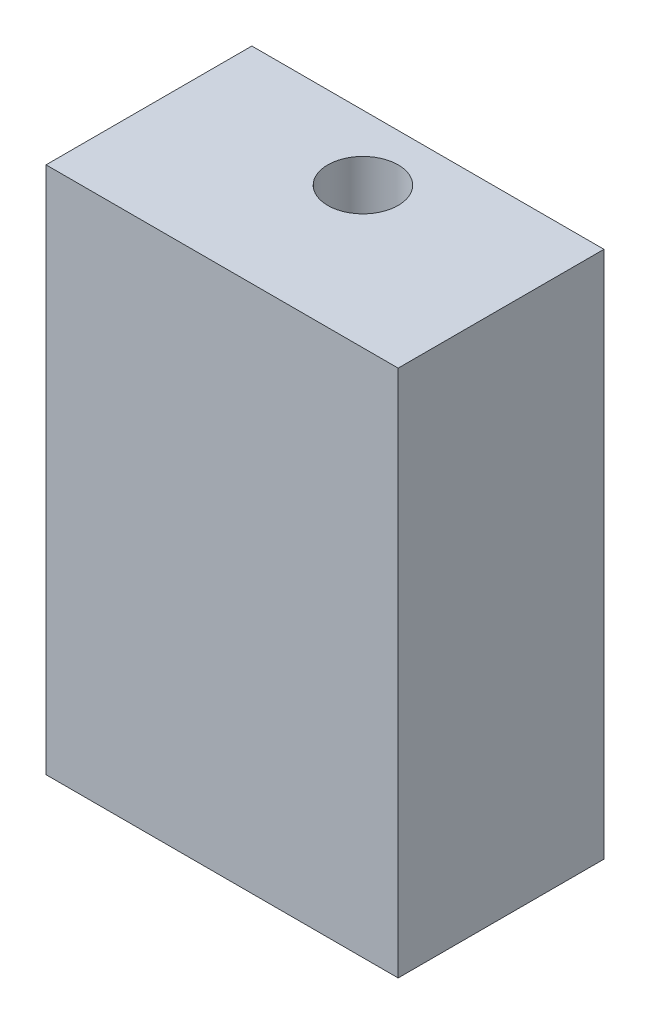
ISO-10303-21;
HEADER;
FILE_DESCRIPTION(('STEP AP214'),'2;1');
FILE_NAME('part.step','',(''),(''),'','','');
FILE_SCHEMA(('AUTOMOTIVE_DESIGN { 1 0 10303 214 1 1 1 1 }'));
ENDSEC;
DATA;
#1=APPLICATION_CONTEXT('core data for automotive mechanical design processes');
#2=APPLICATION_PROTOCOL_DEFINITION('international standard','automotive_design',2000,#1);
#3=PRODUCT_CONTEXT('',#1,'mechanical');
#4=PRODUCT('Part','Part','',(#3));
#5=PRODUCT_RELATED_PRODUCT_CATEGORY('part','',(#4));
#6=PRODUCT_DEFINITION_FORMATION('','',#4);
#7=PRODUCT_DEFINITION_CONTEXT('part definition',#1,'design');
#8=PRODUCT_DEFINITION('design','',#6,#7);
#9=PRODUCT_DEFINITION_SHAPE('','',#8);
#10=(LENGTH_UNIT() NAMED_UNIT(*) SI_UNIT(.MILLI.,.METRE.));
#11=(NAMED_UNIT(*) PLANE_ANGLE_UNIT() SI_UNIT($,.RADIAN.));
#12=(NAMED_UNIT(*) SI_UNIT($,.STERADIAN.) SOLID_ANGLE_UNIT());
#13=UNCERTAINTY_MEASURE_WITH_UNIT(LENGTH_MEASURE(1.E-05),#10,'distance_accuracy_value','');
#14=(GEOMETRIC_REPRESENTATION_CONTEXT(3) GLOBAL_UNCERTAINTY_ASSIGNED_CONTEXT((#13)) GLOBAL_UNIT_ASSIGNED_CONTEXT((#10,
#11,#12)) REPRESENTATION_CONTEXT('',''));
#15=CARTESIAN_POINT('',(0.,0.,0.));
#16=DIRECTION('',(0.,0.,1.));
#17=DIRECTION('',(1.,0.,0.));
#18=AXIS2_PLACEMENT_3D('',#15,#16,#17);
#19=CARTESIAN_POINT('',(0.,30.,0.));
#20=DIRECTION('',(0.,1.,0.));
#21=DIRECTION('',(0.,0.,1.));
#22=AXIS2_PLACEMENT_3D('',#19,#20,#21);
#23=PLANE('',#22);
#24=DIRECTION('',(0.,0.,1.));
#25=VECTOR('',#24,1.);
#26=CARTESIAN_POINT('',(-10.,30.,-3.69));
#27=LINE('',#26,#25);
#28=CARTESIAN_POINT('',(-10.,30.,-3.69));
#29=VERTEX_POINT('',#28);
#30=CARTESIAN_POINT('',(-10.,30.,8.));
#31=VERTEX_POINT('',#30);
#32=EDGE_CURVE('E87',#29,#31,#27,.T.);
#33=ORIENTED_EDGE('',*,*,#32,.T.);
#34=DIRECTION('',(1.,0.,0.));
#35=VECTOR('',#34,1.);
#36=CARTESIAN_POINT('',(-10.,30.,8.));
#37=LINE('',#36,#35);
#38=CARTESIAN_POINT('',(10.,30.,8.));
#39=VERTEX_POINT('',#38);
#40=EDGE_CURVE('E82',#31,#39,#37,.T.);
#41=ORIENTED_EDGE('',*,*,#40,.T.);
#42=DIRECTION('',(0.,0.,-1.));
#43=VECTOR('',#42,1.);
#44=CARTESIAN_POINT('',(10.,30.,-3.69));
#45=LINE('',#44,#43);
#46=CARTESIAN_POINT('',(10.,30.,-3.69));
#47=VERTEX_POINT('',#46);
#48=EDGE_CURVE('E85',#39,#47,#45,.T.);
#49=ORIENTED_EDGE('',*,*,#48,.T.);
#50=DIRECTION('',(-1.,0.,0.));
#51=VECTOR('',#50,1.);
#52=CARTESIAN_POINT('',(-10.,30.,-3.69));
#53=LINE('',#52,#51);
#54=EDGE_CURVE('E52',#47,#29,#53,.T.);
#55=ORIENTED_EDGE('',*,*,#54,.T.);
#56=EDGE_LOOP('',(#33,#41,#49,#55));
#57=FACE_BOUND('',#56,.T.);
#58=CARTESIAN_POINT('',(0.,30.,0.));
#59=DIRECTION('',(0.,1.,0.));
#60=DIRECTION('',(0.,0.,1.));
#61=AXIS2_PLACEMENT_3D('',#58,#59,#60);
#62=CIRCLE('',#61,2.);
#63=CARTESIAN_POINT('',(0.,30.,2.));
#64=VERTEX_POINT('',#63);
#65=EDGE_CURVE('E102',#64,#64,#62,.T.);
#66=ORIENTED_EDGE('',*,*,#65,.F.);
#67=EDGE_LOOP('',(#66));
#68=FACE_BOUND('',#67,.T.);
#69=ADVANCED_FACE('F35',(#57,#68),#23,.T.);
#70=CARTESIAN_POINT('',(0.,0.,0.));
#71=DIRECTION('',(0.,1.,0.));
#72=DIRECTION('',(0.,0.,1.));
#73=AXIS2_PLACEMENT_3D('',#70,#71,#72);
#74=PLANE('',#73);
#75=DIRECTION('',(0.,0.,1.));
#76=VECTOR('',#75,1.);
#77=CARTESIAN_POINT('',(-10.,0.,-3.69));
#78=LINE('',#77,#76);
#79=CARTESIAN_POINT('',(-10.,0.,-3.69));
#80=VERTEX_POINT('',#79);
#81=CARTESIAN_POINT('',(-10.,0.,8.));
#82=VERTEX_POINT('',#81);
#83=EDGE_CURVE('E99',#80,#82,#78,.T.);
#84=ORIENTED_EDGE('',*,*,#83,.F.);
#85=DIRECTION('',(-1.,0.,0.));
#86=VECTOR('',#85,1.);
#87=CARTESIAN_POINT('',(-10.,0.,-3.69));
#88=LINE('',#87,#86);
#89=CARTESIAN_POINT('',(10.,0.,-3.69));
#90=VERTEX_POINT('',#89);
#91=EDGE_CURVE('E75',#90,#80,#88,.T.);
#92=ORIENTED_EDGE('',*,*,#91,.F.);
#93=DIRECTION('',(0.,0.,-1.));
#94=VECTOR('',#93,1.);
#95=CARTESIAN_POINT('',(10.,0.,-3.69));
#96=LINE('',#95,#94);
#97=CARTESIAN_POINT('',(10.,0.,8.));
#98=VERTEX_POINT('',#97);
#99=EDGE_CURVE('E69',#98,#90,#96,.T.);
#100=ORIENTED_EDGE('',*,*,#99,.F.);
#101=DIRECTION('',(1.,0.,0.));
#102=VECTOR('',#101,1.);
#103=CARTESIAN_POINT('',(-10.,0.,8.));
#104=LINE('',#103,#102);
#105=EDGE_CURVE('E91',#82,#98,#104,.T.);
#106=ORIENTED_EDGE('',*,*,#105,.F.);
#107=EDGE_LOOP('',(#84,#92,#100,#106));
#108=FACE_BOUND('',#107,.T.);
#109=CARTESIAN_POINT('',(0.,0.,0.));
#110=DIRECTION('',(0.,1.,0.));
#111=DIRECTION('',(0.,0.,1.));
#112=AXIS2_PLACEMENT_3D('',#109,#110,#111);
#113=CIRCLE('',#112,2.);
#114=CARTESIAN_POINT('',(0.,0.,2.));
#115=VERTEX_POINT('',#114);
#116=EDGE_CURVE('E114',#115,#115,#113,.T.);
#117=ORIENTED_EDGE('',*,*,#116,.T.);
#118=EDGE_LOOP('',(#117));
#119=FACE_BOUND('',#118,.T.);
#120=ADVANCED_FACE('F110',(#108,#119),#74,.F.);
#121=CARTESIAN_POINT('',(-10.,30.,-3.69));
#122=DIRECTION('',(1.,0.,0.));
#123=DIRECTION('',(0.,0.,-1.));
#124=AXIS2_PLACEMENT_3D('',#121,#122,#123);
#125=PLANE('',#124);
#126=ORIENTED_EDGE('',*,*,#83,.T.);
#127=DIRECTION('',(0.,-1.,0.));
#128=VECTOR('',#127,1.);
#129=CARTESIAN_POINT('',(-10.,30.,8.));
#130=LINE('',#129,#128);
#131=EDGE_CURVE('E11',#31,#82,#130,.T.);
#132=ORIENTED_EDGE('',*,*,#131,.F.);
#133=ORIENTED_EDGE('',*,*,#32,.F.);
#134=DIRECTION('',(0.,-1.,0.));
#135=VECTOR('',#134,1.);
#136=CARTESIAN_POINT('',(-10.,30.,-3.69));
#137=LINE('',#136,#135);
#138=EDGE_CURVE('E95',#29,#80,#137,.T.);
#139=ORIENTED_EDGE('',*,*,#138,.T.);
#140=EDGE_LOOP('',(#126,#132,#133,#139));
#141=FACE_BOUND('',#140,.T.);
#142=ADVANCED_FACE('F37',(#141),#125,.F.);
#143=CARTESIAN_POINT('',(-10.,30.,8.));
#144=DIRECTION('',(0.,0.,-1.));
#145=DIRECTION('',(-1.,0.,0.));
#146=AXIS2_PLACEMENT_3D('',#143,#144,#145);
#147=PLANE('',#146);
#148=ORIENTED_EDGE('',*,*,#105,.T.);
#149=DIRECTION('',(0.,-1.,0.));
#150=VECTOR('',#149,1.);
#151=CARTESIAN_POINT('',(10.,30.,8.));
#152=LINE('',#151,#150);
#153=EDGE_CURVE('E44',#39,#98,#152,.T.);
#154=ORIENTED_EDGE('',*,*,#153,.F.);
#155=ORIENTED_EDGE('',*,*,#40,.F.);
#156=ORIENTED_EDGE('',*,*,#131,.T.);
#157=EDGE_LOOP('',(#148,#154,#155,#156));
#158=FACE_BOUND('',#157,.T.);
#159=ADVANCED_FACE('F90',(#158),#147,.F.);
#160=CARTESIAN_POINT('',(10.,30.,-3.69));
#161=DIRECTION('',(-1.,0.,0.));
#162=DIRECTION('',(0.,0.,1.));
#163=AXIS2_PLACEMENT_3D('',#160,#161,#162);
#164=PLANE('',#163);
#165=ORIENTED_EDGE('',*,*,#99,.T.);
#166=DIRECTION('',(0.,-1.,0.));
#167=VECTOR('',#166,1.);
#168=CARTESIAN_POINT('',(10.,30.,-3.69));
#169=LINE('',#168,#167);
#170=EDGE_CURVE('E92',#47,#90,#169,.T.);
#171=ORIENTED_EDGE('',*,*,#170,.F.);
#172=ORIENTED_EDGE('',*,*,#48,.F.);
#173=ORIENTED_EDGE('',*,*,#153,.T.);
#174=EDGE_LOOP('',(#165,#171,#172,#173));
#175=FACE_BOUND('',#174,.T.);
#176=ADVANCED_FACE('F93',(#175),#164,.F.);
#177=CARTESIAN_POINT('',(-10.,30.,-3.69));
#178=DIRECTION('',(0.,0.,1.));
#179=DIRECTION('',(1.,0.,0.));
#180=AXIS2_PLACEMENT_3D('',#177,#178,#179);
#181=PLANE('',#180);
#182=ORIENTED_EDGE('',*,*,#91,.T.);
#183=ORIENTED_EDGE('',*,*,#138,.F.);
#184=ORIENTED_EDGE('',*,*,#54,.F.);
#185=ORIENTED_EDGE('',*,*,#170,.T.);
#186=EDGE_LOOP('',(#182,#183,#184,#185));
#187=FACE_BOUND('',#186,.T.);
#188=ADVANCED_FACE('F107',(#187),#181,.F.);
#189=CARTESIAN_POINT('',(0.,30.,0.));
#190=DIRECTION('',(0.,-1.,0.));
#191=DIRECTION('',(0.,0.,-1.));
#192=AXIS2_PLACEMENT_3D('',#189,#190,#191);
#193=CYLINDRICAL_SURFACE('',#192,2.);
#194=ORIENTED_EDGE('',*,*,#65,.T.);
#195=EDGE_LOOP('',(#194));
#196=FACE_BOUND('',#195,.T.);
#197=ORIENTED_EDGE('',*,*,#116,.F.);
#198=EDGE_LOOP('',(#197));
#199=FACE_BOUND('',#198,.T.);
#200=ADVANCED_FACE('F120',(#196,#199),#193,.F.);
#201=CLOSED_SHELL('',(#69,#120,#142,#159,#176,#188,#200));
#202=MANIFOLD_SOLID_BREP('B2',#201);
#203=ADVANCED_BREP_SHAPE_REPRESENTATION('',(#18,#202),#14);
#204=SHAPE_DEFINITION_REPRESENTATION(#9,#203);
ENDSEC;
END-ISO-10303-21;
